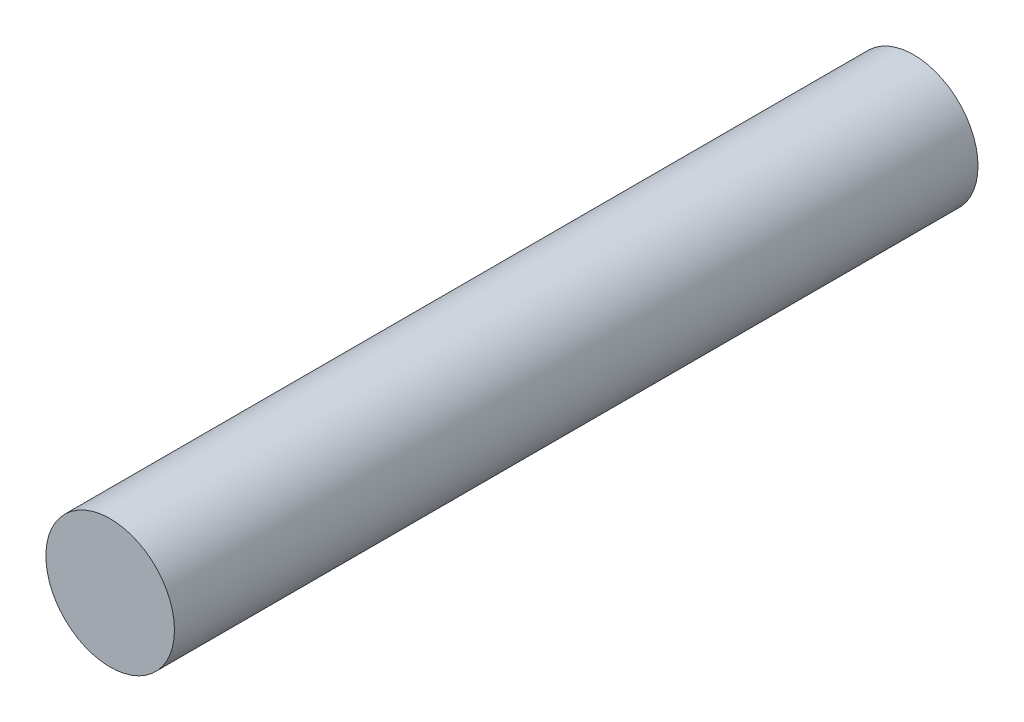
ISO-10303-21;
HEADER;
FILE_DESCRIPTION(('STEP AP214'),'2;1');
FILE_NAME('part.step','',(''),(''),'','','');
FILE_SCHEMA(('AUTOMOTIVE_DESIGN { 1 0 10303 214 1 1 1 1 }'));
ENDSEC;
DATA;
#1=APPLICATION_CONTEXT('core data for automotive mechanical design processes');
#2=APPLICATION_PROTOCOL_DEFINITION('international standard','automotive_design',2000,#1);
#3=PRODUCT_CONTEXT('',#1,'mechanical');
#4=PRODUCT('Part','Part','',(#3));
#5=PRODUCT_RELATED_PRODUCT_CATEGORY('part','',(#4));
#6=PRODUCT_DEFINITION_FORMATION('','',#4);
#7=PRODUCT_DEFINITION_CONTEXT('part definition',#1,'design');
#8=PRODUCT_DEFINITION('design','',#6,#7);
#9=PRODUCT_DEFINITION_SHAPE('','',#8);
#10=(LENGTH_UNIT() NAMED_UNIT(*) SI_UNIT(.MILLI.,.METRE.));
#11=(NAMED_UNIT(*) PLANE_ANGLE_UNIT() SI_UNIT($,.RADIAN.));
#12=(NAMED_UNIT(*) SI_UNIT($,.STERADIAN.) SOLID_ANGLE_UNIT());
#13=UNCERTAINTY_MEASURE_WITH_UNIT(LENGTH_MEASURE(1.E-05),#10,'distance_accuracy_value','');
#14=(GEOMETRIC_REPRESENTATION_CONTEXT(3) GLOBAL_UNCERTAINTY_ASSIGNED_CONTEXT((#13)) GLOBAL_UNIT_ASSIGNED_CONTEXT((#10,
#11,#12)) REPRESENTATION_CONTEXT('',''));
#15=CARTESIAN_POINT('',(0.,0.,0.));
#16=DIRECTION('',(0.,0.,1.));
#17=DIRECTION('',(1.,0.,0.));
#18=AXIS2_PLACEMENT_3D('',#15,#16,#17);
#19=CARTESIAN_POINT('',(0.,0.,12.7));
#20=DIRECTION('',(0.,0.,-1.));
#21=DIRECTION('',(-1.,0.,0.));
#22=AXIS2_PLACEMENT_3D('',#19,#20,#21);
#23=CYLINDRICAL_SURFACE('',#22,2.032);
#24=CARTESIAN_POINT('',(0.,0.,12.7));
#25=DIRECTION('',(0.,0.,1.));
#26=DIRECTION('',(1.,0.,0.));
#27=AXIS2_PLACEMENT_3D('',#24,#25,#26);
#28=CIRCLE('',#27,2.032);
#29=CARTESIAN_POINT('',(2.032,0.,12.7));
#30=VERTEX_POINT('',#29);
#31=EDGE_CURVE('E10',#30,#30,#28,.T.);
#32=ORIENTED_EDGE('',*,*,#31,.F.);
#33=EDGE_LOOP('',(#32));
#34=FACE_BOUND('',#33,.T.);
#35=CARTESIAN_POINT('',(0.,0.,-12.7));
#36=DIRECTION('',(0.,0.,1.));
#37=DIRECTION('',(1.,0.,0.));
#38=AXIS2_PLACEMENT_3D('',#35,#36,#37);
#39=CIRCLE('',#38,2.032);
#40=CARTESIAN_POINT('',(2.032,0.,-12.7));
#41=VERTEX_POINT('',#40);
#42=EDGE_CURVE('E37',#41,#41,#39,.T.);
#43=ORIENTED_EDGE('',*,*,#42,.T.);
#44=EDGE_LOOP('',(#43));
#45=FACE_BOUND('',#44,.T.);
#46=ADVANCED_FACE('F34',(#34,#45),#23,.T.);
#47=CARTESIAN_POINT('',(0.,0.,12.7));
#48=DIRECTION('',(0.,0.,1.));
#49=DIRECTION('',(1.,0.,0.));
#50=AXIS2_PLACEMENT_3D('',#47,#48,#49);
#51=PLANE('',#50);
#52=ORIENTED_EDGE('',*,*,#31,.T.);
#53=EDGE_LOOP('',(#52));
#54=FACE_BOUND('',#53,.T.);
#55=ADVANCED_FACE('F49',(#54),#51,.T.);
#56=CARTESIAN_POINT('',(0.,0.,-12.7));
#57=DIRECTION('',(0.,0.,1.));
#58=DIRECTION('',(1.,0.,0.));
#59=AXIS2_PLACEMENT_3D('',#56,#57,#58);
#60=PLANE('',#59);
#61=ORIENTED_EDGE('',*,*,#42,.F.);
#62=EDGE_LOOP('',(#61));
#63=FACE_BOUND('',#62,.T.);
#64=ADVANCED_FACE('F47',(#63),#60,.F.);
#65=CLOSED_SHELL('',(#46,#55,#64));
#66=MANIFOLD_SOLID_BREP('B2',#65);
#67=ADVANCED_BREP_SHAPE_REPRESENTATION('',(#18,#66),#14);
#68=SHAPE_DEFINITION_REPRESENTATION(#9,#67);
ENDSEC;
END-ISO-10303-21;
